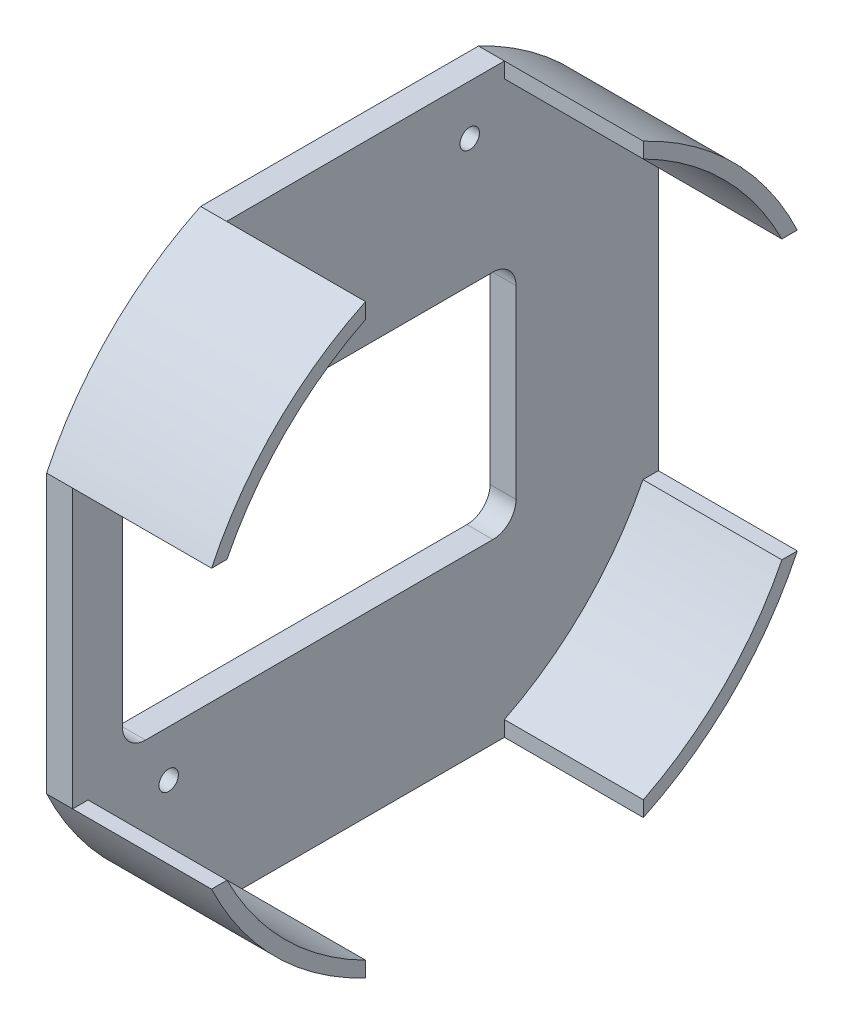
ISO-10303-21;
HEADER;
FILE_DESCRIPTION(('STEP AP214'),'2;1');
FILE_NAME('part.step','',(''),(''),'','','');
FILE_SCHEMA(('AUTOMOTIVE_DESIGN { 1 0 10303 214 1 1 1 1 }'));
ENDSEC;
DATA;
#1=APPLICATION_CONTEXT('core data for automotive mechanical design processes');
#2=APPLICATION_PROTOCOL_DEFINITION('international standard','automotive_design',2000,#1);
#3=PRODUCT_CONTEXT('',#1,'mechanical');
#4=PRODUCT('Part','Part','',(#3));
#5=PRODUCT_RELATED_PRODUCT_CATEGORY('part','',(#4));
#6=PRODUCT_DEFINITION_FORMATION('','',#4);
#7=PRODUCT_DEFINITION_CONTEXT('part definition',#1,'design');
#8=PRODUCT_DEFINITION('design','',#6,#7);
#9=PRODUCT_DEFINITION_SHAPE('','',#8);
#10=(LENGTH_UNIT() NAMED_UNIT(*) SI_UNIT(.MILLI.,.METRE.));
#11=(NAMED_UNIT(*) PLANE_ANGLE_UNIT() SI_UNIT($,.RADIAN.));
#12=(NAMED_UNIT(*) SI_UNIT($,.STERADIAN.) SOLID_ANGLE_UNIT());
#13=UNCERTAINTY_MEASURE_WITH_UNIT(LENGTH_MEASURE(1.E-05),#10,'distance_accuracy_value','');
#14=(GEOMETRIC_REPRESENTATION_CONTEXT(3) GLOBAL_UNCERTAINTY_ASSIGNED_CONTEXT((#13)) GLOBAL_UNIT_ASSIGNED_CONTEXT((#10,
#11,#12)) REPRESENTATION_CONTEXT('',''));
#15=CARTESIAN_POINT('',(0.,0.,0.));
#16=DIRECTION('',(0.,0.,1.));
#17=DIRECTION('',(1.,0.,0.));
#18=AXIS2_PLACEMENT_3D('',#15,#16,#17);
#19=CARTESIAN_POINT('',(5.6,0.,-10.));
#20=DIRECTION('',(-1.,0.,0.));
#21=DIRECTION('',(0.,0.,1.));
#22=AXIS2_PLACEMENT_3D('',#19,#20,#21);
#23=CYLINDRICAL_SURFACE('',#22,70.);
#24=DIRECTION('',(-1.,0.,0.));
#25=VECTOR('',#24,1.);
#26=CARTESIAN_POINT('',(35.6,63.2455532033676,20.));
#27=LINE('',#26,#25);
#28=CARTESIAN_POINT('',(35.6,63.2455532033676,20.));
#29=VERTEX_POINT('',#28);
#30=CARTESIAN_POINT('',(5.6,63.2455532033676,20.));
#31=VERTEX_POINT('',#30);
#32=EDGE_CURVE('E240',#29,#31,#27,.T.);
#33=ORIENTED_EDGE('',*,*,#32,.T.);
#34=DIRECTION('',(1.,0.,0.));
#35=VECTOR('',#34,1.);
#36=CARTESIAN_POINT('',(0.,63.2455532033676,20.));
#37=LINE('',#36,#35);
#38=CARTESIAN_POINT('',(0.,63.2455532033676,20.));
#39=VERTEX_POINT('',#38);
#40=EDGE_CURVE('E223',#39,#31,#37,.T.);
#41=ORIENTED_EDGE('',*,*,#40,.F.);
#42=CARTESIAN_POINT('',(0.,0.,-10.));
#43=DIRECTION('',(1.,0.,0.));
#44=DIRECTION('',(0.,0.,-1.));
#45=AXIS2_PLACEMENT_3D('',#42,#43,#44);
#46=CIRCLE('',#45,70.);
#47=CARTESIAN_POINT('',(0.,30.,53.2455532033676));
#48=VERTEX_POINT('',#47);
#49=EDGE_CURVE('E237',#39,#48,#46,.T.);
#50=ORIENTED_EDGE('',*,*,#49,.T.);
#51=DIRECTION('',(1.,0.,0.));
#52=VECTOR('',#51,1.);
#53=CARTESIAN_POINT('',(0.,30.,53.2455532033676));
#54=LINE('',#53,#52);
#55=CARTESIAN_POINT('',(5.6,30.,53.2455532033676));
#56=VERTEX_POINT('',#55);
#57=EDGE_CURVE('E876',#48,#56,#54,.T.);
#58=ORIENTED_EDGE('',*,*,#57,.T.);
#59=DIRECTION('',(-1.,0.,0.));
#60=VECTOR('',#59,1.);
#61=CARTESIAN_POINT('',(35.6,30.,53.2455532033676));
#62=LINE('',#61,#60);
#63=CARTESIAN_POINT('',(35.6,30.,53.2455532033676));
#64=VERTEX_POINT('',#63);
#65=EDGE_CURVE('E437',#64,#56,#62,.T.);
#66=ORIENTED_EDGE('',*,*,#65,.F.);
#67=CARTESIAN_POINT('',(35.6,0.,-10.));
#68=DIRECTION('',(1.,0.,0.));
#69=DIRECTION('',(0.,0.,-1.));
#70=AXIS2_PLACEMENT_3D('',#67,#68,#69);
#71=CIRCLE('',#70,70.);
#72=EDGE_CURVE('E413',#29,#64,#71,.T.);
#73=ORIENTED_EDGE('',*,*,#72,.F.);
#74=EDGE_LOOP('',(#33,#41,#50,#58,#66,#73));
#75=FACE_BOUND('',#74,.T.);
#76=ADVANCED_FACE('F35',(#75),#23,.T.);
#77=DIRECTION('',(-1.,0.,0.));
#78=VECTOR('',#77,1.);
#79=CARTESIAN_POINT('',(35.6,-30.,53.2455532033676));
#80=LINE('',#79,#78);
#81=CARTESIAN_POINT('',(35.6,-30.,53.2455532033676));
#82=VERTEX_POINT('',#81);
#83=CARTESIAN_POINT('',(5.6,-30.,53.2455532033676));
#84=VERTEX_POINT('',#83);
#85=EDGE_CURVE('E393',#82,#84,#80,.T.);
#86=ORIENTED_EDGE('',*,*,#85,.T.);
#87=DIRECTION('',(1.,0.,0.));
#88=VECTOR('',#87,1.);
#89=CARTESIAN_POINT('',(0.,-30.,53.2455532033676));
#90=LINE('',#89,#88);
#91=CARTESIAN_POINT('',(0.,-30.,53.2455532033676));
#92=VERTEX_POINT('',#91);
#93=EDGE_CURVE('E878',#92,#84,#90,.T.);
#94=ORIENTED_EDGE('',*,*,#93,.F.);
#95=CARTESIAN_POINT('',(0.,-63.2455532033676,20.));
#96=VERTEX_POINT('',#95);
#97=EDGE_CURVE('E248',#92,#96,#46,.T.);
#98=ORIENTED_EDGE('',*,*,#97,.T.);
#99=DIRECTION('',(1.,0.,0.));
#100=VECTOR('',#99,1.);
#101=CARTESIAN_POINT('',(0.,-63.2455532033676,20.));
#102=LINE('',#101,#100);
#103=CARTESIAN_POINT('',(5.6,-63.2455532033676,20.));
#104=VERTEX_POINT('',#103);
#105=EDGE_CURVE('E880',#96,#104,#102,.T.);
#106=ORIENTED_EDGE('',*,*,#105,.T.);
#107=DIRECTION('',(-1.,0.,0.));
#108=VECTOR('',#107,1.);
#109=CARTESIAN_POINT('',(35.6,-63.2455532033676,20.));
#110=LINE('',#109,#108);
#111=CARTESIAN_POINT('',(35.6,-63.2455532033676,20.));
#112=VERTEX_POINT('',#111);
#113=EDGE_CURVE('E409',#112,#104,#110,.T.);
#114=ORIENTED_EDGE('',*,*,#113,.F.);
#115=CARTESIAN_POINT('',(35.6,0.,-10.));
#116=DIRECTION('',(1.,0.,0.));
#117=DIRECTION('',(0.,0.,-1.));
#118=AXIS2_PLACEMENT_3D('',#115,#116,#117);
#119=CIRCLE('',#118,70.);
#120=EDGE_CURVE('E383',#82,#112,#119,.T.);
#121=ORIENTED_EDGE('',*,*,#120,.F.);
#122=EDGE_LOOP('',(#86,#94,#98,#106,#114,#121));
#123=FACE_BOUND('',#122,.T.);
#124=ADVANCED_FACE('F502',(#123),#23,.T.);
#125=DIRECTION('',(-1.,0.,0.));
#126=VECTOR('',#125,1.);
#127=CARTESIAN_POINT('',(35.6,-63.2455532033676,-40.));
#128=LINE('',#127,#126);
#129=CARTESIAN_POINT('',(35.6,-63.2455532033676,-40.));
#130=VERTEX_POINT('',#129);
#131=CARTESIAN_POINT('',(5.6,-63.2455532033676,-40.));
#132=VERTEX_POINT('',#131);
#133=EDGE_CURVE('E363',#130,#132,#128,.T.);
#134=ORIENTED_EDGE('',*,*,#133,.T.);
#135=DIRECTION('',(1.,0.,0.));
#136=VECTOR('',#135,1.);
#137=CARTESIAN_POINT('',(0.,-63.2455532033676,-40.));
#138=LINE('',#137,#136);
#139=CARTESIAN_POINT('',(0.,-63.2455532033676,-40.));
#140=VERTEX_POINT('',#139);
#141=EDGE_CURVE('E336',#140,#132,#138,.T.);
#142=ORIENTED_EDGE('',*,*,#141,.F.);
#143=CARTESIAN_POINT('',(0.,-30.,-73.2455532033676));
#144=VERTEX_POINT('',#143);
#145=EDGE_CURVE('E251',#140,#144,#46,.T.);
#146=ORIENTED_EDGE('',*,*,#145,.T.);
#147=DIRECTION('',(1.,0.,0.));
#148=VECTOR('',#147,1.);
#149=CARTESIAN_POINT('',(0.,-30.,-73.2455532033676));
#150=LINE('',#149,#148);
#151=CARTESIAN_POINT('',(5.6,-30.,-73.2455532033676));
#152=VERTEX_POINT('',#151);
#153=EDGE_CURVE('E334',#144,#152,#150,.T.);
#154=ORIENTED_EDGE('',*,*,#153,.T.);
#155=DIRECTION('',(-1.,0.,0.));
#156=VECTOR('',#155,1.);
#157=CARTESIAN_POINT('',(35.6,-30.,-73.2455532033676));
#158=LINE('',#157,#156);
#159=CARTESIAN_POINT('',(35.6,-30.,-73.2455532033676));
#160=VERTEX_POINT('',#159);
#161=EDGE_CURVE('E379',#160,#152,#158,.T.);
#162=ORIENTED_EDGE('',*,*,#161,.F.);
#163=CARTESIAN_POINT('',(35.6,0.,-10.));
#164=DIRECTION('',(1.,0.,0.));
#165=DIRECTION('',(0.,0.,-1.));
#166=AXIS2_PLACEMENT_3D('',#163,#164,#165);
#167=CIRCLE('',#166,70.);
#168=EDGE_CURVE('E353',#130,#160,#167,.T.);
#169=ORIENTED_EDGE('',*,*,#168,.F.);
#170=EDGE_LOOP('',(#134,#142,#146,#154,#162,#169));
#171=FACE_BOUND('',#170,.T.);
#172=ADVANCED_FACE('F332',(#171),#23,.T.);
#173=CARTESIAN_POINT('',(5.6,0.,-10.));
#174=DIRECTION('',(1.,0.,0.));
#175=DIRECTION('',(0.,0.,-1.));
#176=AXIS2_PLACEMENT_3D('',#173,#174,#175);
#177=PLANE('',#176);
#178=DIRECTION('',(0.,0.,-1.));
#179=VECTOR('',#178,1.);
#180=CARTESIAN_POINT('',(5.6,63.2455532033676,0.));
#181=LINE('',#180,#179);
#182=CARTESIAN_POINT('',(5.6,63.2455532033676,-40.));
#183=VERTEX_POINT('',#182);
#184=EDGE_CURVE('E231',#31,#183,#181,.T.);
#185=ORIENTED_EDGE('',*,*,#184,.F.);
#186=DIRECTION('',(0.,1.,0.));
#187=VECTOR('',#186,1.);
#188=CARTESIAN_POINT('',(5.6,63.2455532033676,20.));
#189=LINE('',#188,#187);
#190=CARTESIAN_POINT('',(5.6,59.9082632030007,20.));
#191=VERTEX_POINT('',#190);
#192=EDGE_CURVE('E417',#191,#31,#189,.T.);
#193=ORIENTED_EDGE('',*,*,#192,.F.);
#194=CARTESIAN_POINT('',(5.6,0.,-10.));
#195=DIRECTION('',(-1.,0.,0.));
#196=DIRECTION('',(0.,0.,-1.));
#197=AXIS2_PLACEMENT_3D('',#194,#195,#196);
#198=CIRCLE('',#197,67.);
#199=CARTESIAN_POINT('',(5.6,30.,49.9082632030007));
#200=VERTEX_POINT('',#199);
#201=EDGE_CURVE('E425',#200,#191,#198,.T.);
#202=ORIENTED_EDGE('',*,*,#201,.F.);
#203=DIRECTION('',(0.,0.,-1.));
#204=VECTOR('',#203,1.);
#205=CARTESIAN_POINT('',(5.6,30.,53.2455532033676));
#206=LINE('',#205,#204);
#207=EDGE_CURVE('E412',#56,#200,#206,.T.);
#208=ORIENTED_EDGE('',*,*,#207,.F.);
#209=DIRECTION('',(0.,1.,0.));
#210=VECTOR('',#209,1.);
#211=CARTESIAN_POINT('',(5.6,0.,53.2455532033676));
#212=LINE('',#211,#210);
#213=EDGE_CURVE('E875',#84,#56,#212,.T.);
#214=ORIENTED_EDGE('',*,*,#213,.F.);
#215=DIRECTION('',(0.,0.,1.));
#216=VECTOR('',#215,1.);
#217=CARTESIAN_POINT('',(5.6,-30.,53.2455532033676));
#218=LINE('',#217,#216);
#219=CARTESIAN_POINT('',(5.6,-30.,49.9082632030007));
#220=VERTEX_POINT('',#219);
#221=EDGE_CURVE('E387',#220,#84,#218,.T.);
#222=ORIENTED_EDGE('',*,*,#221,.F.);
#223=CARTESIAN_POINT('',(5.6,0.,-10.));
#224=DIRECTION('',(-1.,0.,0.));
#225=DIRECTION('',(0.,0.,-1.));
#226=AXIS2_PLACEMENT_3D('',#223,#224,#225);
#227=CIRCLE('',#226,67.);
#228=CARTESIAN_POINT('',(5.6,-59.9082632030007,20.));
#229=VERTEX_POINT('',#228);
#230=EDGE_CURVE('E396',#229,#220,#227,.T.);
#231=ORIENTED_EDGE('',*,*,#230,.F.);
#232=DIRECTION('',(0.,1.,0.));
#233=VECTOR('',#232,1.);
#234=CARTESIAN_POINT('',(5.6,-59.9082632030007,20.));
#235=LINE('',#234,#233);
#236=EDGE_CURVE('E382',#104,#229,#235,.T.);
#237=ORIENTED_EDGE('',*,*,#236,.F.);
#238=DIRECTION('',(0.,0.,1.));
#239=VECTOR('',#238,1.);
#240=CARTESIAN_POINT('',(5.6,-63.2455532033676,0.));
#241=LINE('',#240,#239);
#242=EDGE_CURVE('E351',#132,#104,#241,.T.);
#243=ORIENTED_EDGE('',*,*,#242,.F.);
#244=DIRECTION('',(0.,-1.,0.));
#245=VECTOR('',#244,1.);
#246=CARTESIAN_POINT('',(5.6,-59.9082632030007,-40.));
#247=LINE('',#246,#245);
#248=CARTESIAN_POINT('',(5.6,-59.9082632030007,-40.));
#249=VERTEX_POINT('',#248);
#250=EDGE_CURVE('E357',#249,#132,#247,.T.);
#251=ORIENTED_EDGE('',*,*,#250,.F.);
#252=CARTESIAN_POINT('',(5.6,0.,-10.));
#253=DIRECTION('',(-1.,0.,0.));
#254=DIRECTION('',(0.,0.,-1.));
#255=AXIS2_PLACEMENT_3D('',#252,#253,#254);
#256=CIRCLE('',#255,67.);
#257=CARTESIAN_POINT('',(5.6,-30.,-69.9082632030007));
#258=VERTEX_POINT('',#257);
#259=EDGE_CURVE('E367',#258,#249,#256,.T.);
#260=ORIENTED_EDGE('',*,*,#259,.F.);
#261=DIRECTION('',(0.,0.,1.));
#262=VECTOR('',#261,1.);
#263=CARTESIAN_POINT('',(5.6,-30.,-69.9082632030007));
#264=LINE('',#263,#262);
#265=EDGE_CURVE('E364',#152,#258,#264,.T.);
#266=ORIENTED_EDGE('',*,*,#265,.F.);
#267=DIRECTION('',(0.,-1.,0.));
#268=VECTOR('',#267,1.);
#269=CARTESIAN_POINT('',(5.6,0.,-73.2455532033676));
#270=LINE('',#269,#268);
#271=CARTESIAN_POINT('',(5.6,30.,-73.2455532033676));
#272=VERTEX_POINT('',#271);
#273=EDGE_CURVE('E344',#272,#152,#270,.T.);
#274=ORIENTED_EDGE('',*,*,#273,.F.);
#275=DIRECTION('',(0.,0.,-1.));
#276=VECTOR('',#275,1.);
#277=CARTESIAN_POINT('',(5.6,30.,-69.9082632030007));
#278=LINE('',#277,#276);
#279=CARTESIAN_POINT('',(5.6,30.,-69.9082632030007));
#280=VERTEX_POINT('',#279);
#281=EDGE_CURVE('E454',#280,#272,#278,.T.);
#282=ORIENTED_EDGE('',*,*,#281,.F.);
#283=CARTESIAN_POINT('',(5.6,0.,-10.));
#284=DIRECTION('',(-1.,0.,0.));
#285=DIRECTION('',(0.,0.,-1.));
#286=AXIS2_PLACEMENT_3D('',#283,#284,#285);
#287=CIRCLE('',#286,67.);
#288=CARTESIAN_POINT('',(5.6,59.9082632030007,-40.));
#289=VERTEX_POINT('',#288);
#290=EDGE_CURVE('E440',#289,#280,#287,.T.);
#291=ORIENTED_EDGE('',*,*,#290,.F.);
#292=DIRECTION('',(0.,-1.,0.));
#293=VECTOR('',#292,1.);
#294=CARTESIAN_POINT('',(5.6,63.2455532033676,-40.));
#295=LINE('',#294,#293);
#296=EDGE_CURVE('E445',#183,#289,#295,.T.);
#297=ORIENTED_EDGE('',*,*,#296,.F.);
#298=EDGE_LOOP('',(#185,#193,#202,#208,#214,#222,#231,#237,#243,#251,#260,#266,#274,#282,#291,#297));
#299=FACE_BOUND('',#298,.T.);
#300=DIRECTION('',(0.,0.,1.));
#301=VECTOR('',#300,1.);
#302=CARTESIAN_POINT('',(5.6,25.,42.5));
#303=LINE('',#302,#301);
#304=CARTESIAN_POINT('',(5.6,25.,-37.5));
#305=VERTEX_POINT('',#304);
#306=CARTESIAN_POINT('',(5.6,25.,37.5));
#307=VERTEX_POINT('',#306);
#308=EDGE_CURVE('E314',#305,#307,#303,.T.);
#309=ORIENTED_EDGE('',*,*,#308,.F.);
#310=CARTESIAN_POINT('',(5.6,20.,-37.5));
#311=DIRECTION('',(1.,0.,0.));
#312=DIRECTION('',(0.,0.,-1.));
#313=AXIS2_PLACEMENT_3D('',#310,#311,#312);
#314=CIRCLE('',#313,5.);
#315=CARTESIAN_POINT('',(5.6,20.,-42.5));
#316=VERTEX_POINT('',#315);
#317=EDGE_CURVE('E50',#305,#316,#314,.F.);
#318=ORIENTED_EDGE('',*,*,#317,.T.);
#319=DIRECTION('',(0.,1.,0.));
#320=VECTOR('',#319,1.);
#321=CARTESIAN_POINT('',(5.6,25.,-42.5));
#322=LINE('',#321,#320);
#323=CARTESIAN_POINT('',(5.6,-20.,-42.5));
#324=VERTEX_POINT('',#323);
#325=EDGE_CURVE('E305',#324,#316,#322,.T.);
#326=ORIENTED_EDGE('',*,*,#325,.F.);
#327=CARTESIAN_POINT('',(5.6,-20.,-37.5));
#328=DIRECTION('',(1.,0.,0.));
#329=DIRECTION('',(0.,0.,-1.));
#330=AXIS2_PLACEMENT_3D('',#327,#328,#329);
#331=CIRCLE('',#330,5.);
#332=CARTESIAN_POINT('',(5.6,-25.,-37.5));
#333=VERTEX_POINT('',#332);
#334=EDGE_CURVE('E11',#324,#333,#331,.F.);
#335=ORIENTED_EDGE('',*,*,#334,.T.);
#336=DIRECTION('',(0.,0.,-1.));
#337=VECTOR('',#336,1.);
#338=CARTESIAN_POINT('',(5.6,-25.,42.5));
#339=LINE('',#338,#337);
#340=CARTESIAN_POINT('',(5.6,-25.,37.5));
#341=VERTEX_POINT('',#340);
#342=EDGE_CURVE('E303',#341,#333,#339,.T.);
#343=ORIENTED_EDGE('',*,*,#342,.F.);
#344=CARTESIAN_POINT('',(5.6,-20.,37.5));
#345=DIRECTION('',(1.,0.,0.));
#346=DIRECTION('',(0.,0.,-1.));
#347=AXIS2_PLACEMENT_3D('',#344,#345,#346);
#348=CIRCLE('',#347,5.);
#349=CARTESIAN_POINT('',(5.6,-20.,42.5));
#350=VERTEX_POINT('',#349);
#351=EDGE_CURVE('E281',#341,#350,#348,.F.);
#352=ORIENTED_EDGE('',*,*,#351,.T.);
#353=DIRECTION('',(0.,-1.,0.));
#354=VECTOR('',#353,1.);
#355=CARTESIAN_POINT('',(5.6,25.,42.5));
#356=LINE('',#355,#354);
#357=CARTESIAN_POINT('',(5.6,20.,42.5));
#358=VERTEX_POINT('',#357);
#359=EDGE_CURVE('E309',#358,#350,#356,.T.);
#360=ORIENTED_EDGE('',*,*,#359,.F.);
#361=CARTESIAN_POINT('',(5.6,20.,37.5));
#362=DIRECTION('',(1.,0.,0.));
#363=DIRECTION('',(0.,0.,-1.));
#364=AXIS2_PLACEMENT_3D('',#361,#362,#363);
#365=CIRCLE('',#364,5.);
#366=EDGE_CURVE('E277',#358,#307,#365,.F.);
#367=ORIENTED_EDGE('',*,*,#366,.T.);
#368=EDGE_LOOP('',(#309,#318,#326,#335,#343,#352,#360,#367));
#369=FACE_BOUND('',#368,.T.);
#370=CARTESIAN_POINT('',(5.6,52.5,-32.5));
#371=DIRECTION('',(1.,0.,0.));
#372=DIRECTION('',(0.,0.,1.));
#373=AXIS2_PLACEMENT_3D('',#370,#371,#372);
#374=CIRCLE('',#373,2.1);
#375=CARTESIAN_POINT('',(5.6,52.5,-30.4));
#376=VERTEX_POINT('',#375);
#377=EDGE_CURVE('E312',#376,#376,#374,.T.);
#378=ORIENTED_EDGE('',*,*,#377,.F.);
#379=EDGE_LOOP('',(#378));
#380=FACE_BOUND('',#379,.T.);
#381=CARTESIAN_POINT('',(5.6,-35.,32.5));
#382=DIRECTION('',(1.,0.,0.));
#383=DIRECTION('',(0.,0.,-1.));
#384=AXIS2_PLACEMENT_3D('',#381,#382,#383);
#385=CIRCLE('',#384,2.1);
#386=CARTESIAN_POINT('',(5.6,-35.,30.4));
#387=VERTEX_POINT('',#386);
#388=EDGE_CURVE('E296',#387,#387,#385,.T.);
#389=ORIENTED_EDGE('',*,*,#388,.F.);
#390=EDGE_LOOP('',(#389));
#391=FACE_BOUND('',#390,.T.);
#392=ADVANCED_FACE('F301',(#299,#369,#380,#391),#177,.T.);
#393=CARTESIAN_POINT('',(0.,0.,-10.));
#394=DIRECTION('',(1.,0.,0.));
#395=DIRECTION('',(0.,0.,-1.));
#396=AXIS2_PLACEMENT_3D('',#393,#394,#395);
#397=PLANE('',#396);
#398=CARTESIAN_POINT('',(0.,52.5,-32.5));
#399=DIRECTION('',(1.,0.,0.));
#400=DIRECTION('',(0.,0.,1.));
#401=AXIS2_PLACEMENT_3D('',#398,#399,#400);
#402=CIRCLE('',#401,2.1);
#403=CARTESIAN_POINT('',(0.,52.5,-30.4));
#404=VERTEX_POINT('',#403);
#405=EDGE_CURVE('E255',#404,#404,#402,.T.);
#406=ORIENTED_EDGE('',*,*,#405,.T.);
#407=EDGE_LOOP('',(#406));
#408=FACE_BOUND('',#407,.T.);
#409=ORIENTED_EDGE('',*,*,#49,.F.);
#410=DIRECTION('',(0.,0.,-1.));
#411=VECTOR('',#410,1.);
#412=CARTESIAN_POINT('',(0.,63.2455532033676,0.));
#413=LINE('',#412,#411);
#414=CARTESIAN_POINT('',(0.,63.2455532033676,-40.));
#415=VERTEX_POINT('',#414);
#416=EDGE_CURVE('E220',#39,#415,#413,.T.);
#417=ORIENTED_EDGE('',*,*,#416,.T.);
#418=CARTESIAN_POINT('',(0.,30.,-73.2455532033676));
#419=VERTEX_POINT('',#418);
#420=EDGE_CURVE('E247',#419,#415,#46,.T.);
#421=ORIENTED_EDGE('',*,*,#420,.F.);
#422=DIRECTION('',(0.,-1.,0.));
#423=VECTOR('',#422,1.);
#424=CARTESIAN_POINT('',(0.,0.,-73.2455532033676));
#425=LINE('',#424,#423);
#426=EDGE_CURVE('E340',#419,#144,#425,.T.);
#427=ORIENTED_EDGE('',*,*,#426,.T.);
#428=ORIENTED_EDGE('',*,*,#145,.F.);
#429=DIRECTION('',(0.,0.,1.));
#430=VECTOR('',#429,1.);
#431=CARTESIAN_POINT('',(0.,-63.2455532033676,0.));
#432=LINE('',#431,#430);
#433=EDGE_CURVE('E339',#140,#96,#432,.T.);
#434=ORIENTED_EDGE('',*,*,#433,.T.);
#435=ORIENTED_EDGE('',*,*,#97,.F.);
#436=DIRECTION('',(0.,1.,0.));
#437=VECTOR('',#436,1.);
#438=CARTESIAN_POINT('',(0.,0.,53.2455532033676));
#439=LINE('',#438,#437);
#440=EDGE_CURVE('E246',#92,#48,#439,.T.);
#441=ORIENTED_EDGE('',*,*,#440,.T.);
#442=EDGE_LOOP('',(#409,#417,#421,#427,#428,#434,#435,#441));
#443=FACE_BOUND('',#442,.T.);
#444=DIRECTION('',(0.,0.,-1.));
#445=VECTOR('',#444,1.);
#446=CARTESIAN_POINT('',(0.,-25.,42.5));
#447=LINE('',#446,#445);
#448=CARTESIAN_POINT('',(0.,-25.,37.5));
#449=VERTEX_POINT('',#448);
#450=CARTESIAN_POINT('',(0.,-25.,-37.5));
#451=VERTEX_POINT('',#450);
#452=EDGE_CURVE('E290',#449,#451,#447,.T.);
#453=ORIENTED_EDGE('',*,*,#452,.T.);
#454=CARTESIAN_POINT('',(0.,-20.,-37.5));
#455=DIRECTION('',(1.,0.,0.));
#456=DIRECTION('',(0.,0.,-1.));
#457=AXIS2_PLACEMENT_3D('',#454,#455,#456);
#458=CIRCLE('',#457,5.);
#459=CARTESIAN_POINT('',(0.,-20.,-42.5));
#460=VERTEX_POINT('',#459);
#461=EDGE_CURVE('E43',#451,#460,#458,.T.);
#462=ORIENTED_EDGE('',*,*,#461,.T.);
#463=DIRECTION('',(0.,1.,0.));
#464=VECTOR('',#463,1.);
#465=CARTESIAN_POINT('',(0.,25.,-42.5));
#466=LINE('',#465,#464);
#467=CARTESIAN_POINT('',(0.,20.,-42.5));
#468=VERTEX_POINT('',#467);
#469=EDGE_CURVE('E288',#460,#468,#466,.T.);
#470=ORIENTED_EDGE('',*,*,#469,.T.);
#471=CARTESIAN_POINT('',(0.,20.,-37.5));
#472=DIRECTION('',(1.,0.,0.));
#473=DIRECTION('',(0.,0.,-1.));
#474=AXIS2_PLACEMENT_3D('',#471,#472,#473);
#475=CIRCLE('',#474,5.);
#476=CARTESIAN_POINT('',(0.,25.,-37.5));
#477=VERTEX_POINT('',#476);
#478=EDGE_CURVE('E283',#468,#477,#475,.T.);
#479=ORIENTED_EDGE('',*,*,#478,.T.);
#480=DIRECTION('',(0.,0.,1.));
#481=VECTOR('',#480,1.);
#482=CARTESIAN_POINT('',(0.,25.,42.5));
#483=LINE('',#482,#481);
#484=CARTESIAN_POINT('',(0.,25.,37.5));
#485=VERTEX_POINT('',#484);
#486=EDGE_CURVE('E295',#477,#485,#483,.T.);
#487=ORIENTED_EDGE('',*,*,#486,.T.);
#488=CARTESIAN_POINT('',(0.,20.,37.5));
#489=DIRECTION('',(1.,0.,0.));
#490=DIRECTION('',(0.,0.,-1.));
#491=AXIS2_PLACEMENT_3D('',#488,#489,#490);
#492=CIRCLE('',#491,5.);
#493=CARTESIAN_POINT('',(0.,20.,42.5));
#494=VERTEX_POINT('',#493);
#495=EDGE_CURVE('E275',#485,#494,#492,.T.);
#496=ORIENTED_EDGE('',*,*,#495,.T.);
#497=DIRECTION('',(0.,-1.,0.));
#498=VECTOR('',#497,1.);
#499=CARTESIAN_POINT('',(0.,25.,42.5));
#500=LINE('',#499,#498);
#501=CARTESIAN_POINT('',(0.,-20.,42.5));
#502=VERTEX_POINT('',#501);
#503=EDGE_CURVE('E320',#494,#502,#500,.T.);
#504=ORIENTED_EDGE('',*,*,#503,.T.);
#505=CARTESIAN_POINT('',(0.,-20.,37.5));
#506=DIRECTION('',(1.,0.,0.));
#507=DIRECTION('',(0.,0.,-1.));
#508=AXIS2_PLACEMENT_3D('',#505,#506,#507);
#509=CIRCLE('',#508,5.);
#510=EDGE_CURVE('E279',#502,#449,#509,.T.);
#511=ORIENTED_EDGE('',*,*,#510,.T.);
#512=EDGE_LOOP('',(#453,#462,#470,#479,#487,#496,#504,#511));
#513=FACE_BOUND('',#512,.T.);
#514=CARTESIAN_POINT('',(0.,-35.,32.5));
#515=DIRECTION('',(1.,0.,0.));
#516=DIRECTION('',(0.,0.,-1.));
#517=AXIS2_PLACEMENT_3D('',#514,#515,#516);
#518=CIRCLE('',#517,2.1);
#519=CARTESIAN_POINT('',(0.,-35.,30.4));
#520=VERTEX_POINT('',#519);
#521=EDGE_CURVE('E470',#520,#520,#518,.T.);
#522=ORIENTED_EDGE('',*,*,#521,.T.);
#523=EDGE_LOOP('',(#522));
#524=FACE_BOUND('',#523,.T.);
#525=ADVANCED_FACE('F243',(#408,#443,#513,#524),#397,.F.);
#526=ORIENTED_EDGE('',*,*,#420,.T.);
#527=DIRECTION('',(1.,0.,0.));
#528=VECTOR('',#527,1.);
#529=CARTESIAN_POINT('',(0.,63.2455532033676,-40.));
#530=LINE('',#529,#528);
#531=EDGE_CURVE('E226',#415,#183,#530,.T.);
#532=ORIENTED_EDGE('',*,*,#531,.T.);
#533=DIRECTION('',(-1.,0.,0.));
#534=VECTOR('',#533,1.);
#535=CARTESIAN_POINT('',(35.6,63.2455532033676,-40.));
#536=LINE('',#535,#534);
#537=CARTESIAN_POINT('',(35.6,63.2455532033676,-40.));
#538=VERTEX_POINT('',#537);
#539=EDGE_CURVE('E461',#538,#183,#536,.T.);
#540=ORIENTED_EDGE('',*,*,#539,.F.);
#541=CARTESIAN_POINT('',(35.6,0.,-10.));
#542=DIRECTION('',(1.,0.,0.));
#543=DIRECTION('',(0.,0.,-1.));
#544=AXIS2_PLACEMENT_3D('',#541,#542,#543);
#545=CIRCLE('',#544,70.);
#546=CARTESIAN_POINT('',(35.6,30.,-73.2455532033676));
#547=VERTEX_POINT('',#546);
#548=EDGE_CURVE('E447',#547,#538,#545,.T.);
#549=ORIENTED_EDGE('',*,*,#548,.F.);
#550=DIRECTION('',(-1.,0.,0.));
#551=VECTOR('',#550,1.);
#552=CARTESIAN_POINT('',(35.6,30.,-73.2455532033676));
#553=LINE('',#552,#551);
#554=EDGE_CURVE('E464',#547,#272,#553,.T.);
#555=ORIENTED_EDGE('',*,*,#554,.T.);
#556=DIRECTION('',(1.,0.,0.));
#557=VECTOR('',#556,1.);
#558=CARTESIAN_POINT('',(0.,30.,-73.2455532033676));
#559=LINE('',#558,#557);
#560=EDGE_CURVE('E343',#419,#272,#559,.T.);
#561=ORIENTED_EDGE('',*,*,#560,.F.);
#562=EDGE_LOOP('',(#526,#532,#540,#549,#555,#561));
#563=FACE_BOUND('',#562,.T.);
#564=ADVANCED_FACE('F504',(#563),#23,.T.);
#565=CARTESIAN_POINT('',(5.6,52.5,-32.5));
#566=DIRECTION('',(-1.,0.,0.));
#567=DIRECTION('',(0.,0.,1.));
#568=AXIS2_PLACEMENT_3D('',#565,#566,#567);
#569=CYLINDRICAL_SURFACE('',#568,2.1);
#570=ORIENTED_EDGE('',*,*,#377,.T.);
#571=EDGE_LOOP('',(#570));
#572=FACE_BOUND('',#571,.T.);
#573=ORIENTED_EDGE('',*,*,#405,.F.);
#574=EDGE_LOOP('',(#573));
#575=FACE_BOUND('',#574,.T.);
#576=ADVANCED_FACE('F511',(#572,#575),#569,.F.);
#577=CARTESIAN_POINT('',(5.6,25.,-42.5));
#578=DIRECTION('',(0.,0.,1.));
#579=DIRECTION('',(0.,-1.,0.));
#580=AXIS2_PLACEMENT_3D('',#577,#578,#579);
#581=PLANE('',#580);
#582=ORIENTED_EDGE('',*,*,#325,.T.);
#583=DIRECTION('',(-1.,0.,0.));
#584=VECTOR('',#583,1.);
#585=CARTESIAN_POINT('',(0.,20.,-42.5));
#586=LINE('',#585,#584);
#587=EDGE_CURVE('E272',#316,#468,#586,.T.);
#588=ORIENTED_EDGE('',*,*,#587,.T.);
#589=ORIENTED_EDGE('',*,*,#469,.F.);
#590=DIRECTION('',(-1.,0.,0.));
#591=VECTOR('',#590,1.);
#592=CARTESIAN_POINT('',(5.6,-20.,-42.5));
#593=LINE('',#592,#591);
#594=EDGE_CURVE('E57',#460,#324,#593,.F.);
#595=ORIENTED_EDGE('',*,*,#594,.T.);
#596=EDGE_LOOP('',(#582,#588,#589,#595));
#597=FACE_BOUND('',#596,.T.);
#598=ADVANCED_FACE('F293',(#597),#581,.T.);
#599=CARTESIAN_POINT('',(5.6,25.,42.5));
#600=DIRECTION('',(0.,-1.,0.));
#601=DIRECTION('',(0.,0.,-1.));
#602=AXIS2_PLACEMENT_3D('',#599,#600,#601);
#603=PLANE('',#602);
#604=ORIENTED_EDGE('',*,*,#308,.T.);
#605=DIRECTION('',(-1.,0.,0.));
#606=VECTOR('',#605,1.);
#607=CARTESIAN_POINT('',(0.,25.,37.5));
#608=LINE('',#607,#606);
#609=EDGE_CURVE('E258',#307,#485,#608,.T.);
#610=ORIENTED_EDGE('',*,*,#609,.T.);
#611=ORIENTED_EDGE('',*,*,#486,.F.);
#612=DIRECTION('',(-1.,0.,0.));
#613=VECTOR('',#612,1.);
#614=CARTESIAN_POINT('',(5.6,25.,-37.5));
#615=LINE('',#614,#613);
#616=EDGE_CURVE('E250',#477,#305,#615,.F.);
#617=ORIENTED_EDGE('',*,*,#616,.T.);
#618=EDGE_LOOP('',(#604,#610,#611,#617));
#619=FACE_BOUND('',#618,.T.);
#620=ADVANCED_FACE('F478',(#619),#603,.T.);
#621=CARTESIAN_POINT('',(5.6,25.,42.5));
#622=DIRECTION('',(0.,0.,-1.));
#623=DIRECTION('',(0.,1.,0.));
#624=AXIS2_PLACEMENT_3D('',#621,#622,#623);
#625=PLANE('',#624);
#626=ORIENTED_EDGE('',*,*,#503,.F.);
#627=DIRECTION('',(-1.,0.,0.));
#628=VECTOR('',#627,1.);
#629=CARTESIAN_POINT('',(5.6,20.,42.5));
#630=LINE('',#629,#628);
#631=EDGE_CURVE('E264',#494,#358,#630,.F.);
#632=ORIENTED_EDGE('',*,*,#631,.T.);
#633=ORIENTED_EDGE('',*,*,#359,.T.);
#634=DIRECTION('',(-1.,0.,0.));
#635=VECTOR('',#634,1.);
#636=CARTESIAN_POINT('',(0.,-20.,42.5));
#637=LINE('',#636,#635);
#638=EDGE_CURVE('E261',#350,#502,#637,.T.);
#639=ORIENTED_EDGE('',*,*,#638,.T.);
#640=EDGE_LOOP('',(#626,#632,#633,#639));
#641=FACE_BOUND('',#640,.T.);
#642=ADVANCED_FACE('F487',(#641),#625,.T.);
#643=CARTESIAN_POINT('',(5.6,-25.,42.5));
#644=DIRECTION('',(0.,1.,0.));
#645=DIRECTION('',(0.,0.,1.));
#646=AXIS2_PLACEMENT_3D('',#643,#644,#645);
#647=PLANE('',#646);
#648=ORIENTED_EDGE('',*,*,#452,.F.);
#649=DIRECTION('',(-1.,0.,0.));
#650=VECTOR('',#649,1.);
#651=CARTESIAN_POINT('',(5.6,-25.,37.5));
#652=LINE('',#651,#650);
#653=EDGE_CURVE('E269',#449,#341,#652,.F.);
#654=ORIENTED_EDGE('',*,*,#653,.T.);
#655=ORIENTED_EDGE('',*,*,#342,.T.);
#656=DIRECTION('',(-1.,0.,0.));
#657=VECTOR('',#656,1.);
#658=CARTESIAN_POINT('',(0.,-25.,-37.5));
#659=LINE('',#658,#657);
#660=EDGE_CURVE('E266',#333,#451,#659,.T.);
#661=ORIENTED_EDGE('',*,*,#660,.T.);
#662=EDGE_LOOP('',(#648,#654,#655,#661));
#663=FACE_BOUND('',#662,.T.);
#664=ADVANCED_FACE('F307',(#663),#647,.T.);
#665=CARTESIAN_POINT('',(5.6,-35.,32.5));
#666=DIRECTION('',(-1.,0.,0.));
#667=DIRECTION('',(0.,0.,1.));
#668=AXIS2_PLACEMENT_3D('',#665,#666,#667);
#669=CYLINDRICAL_SURFACE('',#668,2.1);
#670=ORIENTED_EDGE('',*,*,#388,.T.);
#671=EDGE_LOOP('',(#670));
#672=FACE_BOUND('',#671,.T.);
#673=ORIENTED_EDGE('',*,*,#521,.F.);
#674=EDGE_LOOP('',(#673));
#675=FACE_BOUND('',#674,.T.);
#676=ADVANCED_FACE('F536',(#672,#675),#669,.F.);
#677=CARTESIAN_POINT('',(35.6,0.,-10.));
#678=DIRECTION('',(-1.,0.,0.));
#679=DIRECTION('',(0.,0.,1.));
#680=AXIS2_PLACEMENT_3D('',#677,#678,#679);
#681=CYLINDRICAL_SURFACE('',#680,67.);
#682=ORIENTED_EDGE('',*,*,#290,.T.);
#683=DIRECTION('',(-1.,0.,0.));
#684=VECTOR('',#683,1.);
#685=CARTESIAN_POINT('',(35.6,30.,-69.9082632030007));
#686=LINE('',#685,#684);
#687=CARTESIAN_POINT('',(35.6,30.,-69.9082632030007));
#688=VERTEX_POINT('',#687);
#689=EDGE_CURVE('E467',#688,#280,#686,.T.);
#690=ORIENTED_EDGE('',*,*,#689,.F.);
#691=CARTESIAN_POINT('',(35.6,0.,-10.));
#692=DIRECTION('',(-1.,0.,0.));
#693=DIRECTION('',(0.,0.,-1.));
#694=AXIS2_PLACEMENT_3D('',#691,#692,#693);
#695=CIRCLE('',#694,67.);
#696=CARTESIAN_POINT('',(35.6,59.9082632030007,-40.));
#697=VERTEX_POINT('',#696);
#698=EDGE_CURVE('E441',#697,#688,#695,.T.);
#699=ORIENTED_EDGE('',*,*,#698,.F.);
#700=DIRECTION('',(-1.,0.,0.));
#701=VECTOR('',#700,1.);
#702=CARTESIAN_POINT('',(35.6,59.9082632030007,-40.));
#703=LINE('',#702,#701);
#704=EDGE_CURVE('E451',#697,#289,#703,.T.);
#705=ORIENTED_EDGE('',*,*,#704,.T.);
#706=EDGE_LOOP('',(#682,#690,#699,#705));
#707=FACE_BOUND('',#706,.T.);
#708=ADVANCED_FACE('F539',(#707),#681,.F.);
#709=CARTESIAN_POINT('',(35.6,30.,-69.9082632030007));
#710=DIRECTION('',(0.,1.,0.));
#711=DIRECTION('',(0.,0.,1.));
#712=AXIS2_PLACEMENT_3D('',#709,#710,#711);
#713=PLANE('',#712);
#714=ORIENTED_EDGE('',*,*,#281,.T.);
#715=ORIENTED_EDGE('',*,*,#554,.F.);
#716=DIRECTION('',(0.,0.,-1.));
#717=VECTOR('',#716,1.);
#718=CARTESIAN_POINT('',(35.6,30.,-69.9082632030007));
#719=LINE('',#718,#717);
#720=EDGE_CURVE('E444',#688,#547,#719,.T.);
#721=ORIENTED_EDGE('',*,*,#720,.F.);
#722=ORIENTED_EDGE('',*,*,#689,.T.);
#723=EDGE_LOOP('',(#714,#715,#721,#722));
#724=FACE_BOUND('',#723,.T.);
#725=ADVANCED_FACE('F543',(#724),#713,.F.);
#726=CARTESIAN_POINT('',(35.6,63.2455532033676,-40.));
#727=DIRECTION('',(0.,0.,-1.));
#728=DIRECTION('',(-1.,0.,0.));
#729=AXIS2_PLACEMENT_3D('',#726,#727,#728);
#730=PLANE('',#729);
#731=ORIENTED_EDGE('',*,*,#296,.T.);
#732=ORIENTED_EDGE('',*,*,#704,.F.);
#733=DIRECTION('',(0.,-1.,0.));
#734=VECTOR('',#733,1.);
#735=CARTESIAN_POINT('',(35.6,63.2455532033676,-40.));
#736=LINE('',#735,#734);
#737=EDGE_CURVE('E449',#538,#697,#736,.T.);
#738=ORIENTED_EDGE('',*,*,#737,.F.);
#739=ORIENTED_EDGE('',*,*,#539,.T.);
#740=EDGE_LOOP('',(#731,#732,#738,#739));
#741=FACE_BOUND('',#740,.T.);
#742=ADVANCED_FACE('F547',(#741),#730,.F.);
#743=CARTESIAN_POINT('',(35.6,0.,-10.));
#744=DIRECTION('',(1.,0.,0.));
#745=DIRECTION('',(0.,0.,-1.));
#746=AXIS2_PLACEMENT_3D('',#743,#744,#745);
#747=PLANE('',#746);
#748=ORIENTED_EDGE('',*,*,#698,.T.);
#749=ORIENTED_EDGE('',*,*,#720,.T.);
#750=ORIENTED_EDGE('',*,*,#548,.T.);
#751=ORIENTED_EDGE('',*,*,#737,.T.);
#752=EDGE_LOOP('',(#748,#749,#750,#751));
#753=FACE_BOUND('',#752,.T.);
#754=ADVANCED_FACE('F551',(#753),#747,.T.);
#755=CARTESIAN_POINT('',(35.6,30.,53.2455532033676));
#756=DIRECTION('',(0.,1.,0.));
#757=DIRECTION('',(0.,0.,1.));
#758=AXIS2_PLACEMENT_3D('',#755,#756,#757);
#759=PLANE('',#758);
#760=ORIENTED_EDGE('',*,*,#207,.T.);
#761=DIRECTION('',(-1.,0.,0.));
#762=VECTOR('',#761,1.);
#763=CARTESIAN_POINT('',(35.6,30.,49.9082632030007));
#764=LINE('',#763,#762);
#765=CARTESIAN_POINT('',(35.6,30.,49.9082632030007));
#766=VERTEX_POINT('',#765);
#767=EDGE_CURVE('E434',#766,#200,#764,.T.);
#768=ORIENTED_EDGE('',*,*,#767,.F.);
#769=DIRECTION('',(0.,0.,-1.));
#770=VECTOR('',#769,1.);
#771=CARTESIAN_POINT('',(35.6,30.,53.2455532033676));
#772=LINE('',#771,#770);
#773=EDGE_CURVE('E416',#64,#766,#772,.T.);
#774=ORIENTED_EDGE('',*,*,#773,.F.);
#775=ORIENTED_EDGE('',*,*,#65,.T.);
#776=EDGE_LOOP('',(#760,#768,#774,#775));
#777=FACE_BOUND('',#776,.T.);
#778=ADVANCED_FACE('F555',(#777),#759,.F.);
#779=CARTESIAN_POINT('',(35.6,0.,-10.));
#780=DIRECTION('',(-1.,0.,0.));
#781=DIRECTION('',(0.,0.,1.));
#782=AXIS2_PLACEMENT_3D('',#779,#780,#781);
#783=CYLINDRICAL_SURFACE('',#782,67.);
#784=ORIENTED_EDGE('',*,*,#201,.T.);
#785=DIRECTION('',(-1.,0.,0.));
#786=VECTOR('',#785,1.);
#787=CARTESIAN_POINT('',(35.6,59.9082632030007,20.));
#788=LINE('',#787,#786);
#789=CARTESIAN_POINT('',(35.6,59.9082632030007,20.));
#790=VERTEX_POINT('',#789);
#791=EDGE_CURVE('E431',#790,#191,#788,.T.);
#792=ORIENTED_EDGE('',*,*,#791,.F.);
#793=CARTESIAN_POINT('',(35.6,0.,-10.));
#794=DIRECTION('',(-1.,0.,0.));
#795=DIRECTION('',(0.,0.,-1.));
#796=AXIS2_PLACEMENT_3D('',#793,#794,#795);
#797=CIRCLE('',#796,67.);
#798=EDGE_CURVE('E419',#766,#790,#797,.T.);
#799=ORIENTED_EDGE('',*,*,#798,.F.);
#800=ORIENTED_EDGE('',*,*,#767,.T.);
#801=EDGE_LOOP('',(#784,#792,#799,#800));
#802=FACE_BOUND('',#801,.T.);
#803=ADVANCED_FACE('F559',(#802),#783,.F.);
#804=CARTESIAN_POINT('',(35.6,63.2455532033676,20.));
#805=DIRECTION('',(0.,0.,1.));
#806=DIRECTION('',(1.,0.,0.));
#807=AXIS2_PLACEMENT_3D('',#804,#805,#806);
#808=PLANE('',#807);
#809=ORIENTED_EDGE('',*,*,#192,.T.);
#810=ORIENTED_EDGE('',*,*,#32,.F.);
#811=DIRECTION('',(0.,1.,0.));
#812=VECTOR('',#811,1.);
#813=CARTESIAN_POINT('',(35.6,63.2455532033676,20.));
#814=LINE('',#813,#812);
#815=EDGE_CURVE('E421',#790,#29,#814,.T.);
#816=ORIENTED_EDGE('',*,*,#815,.F.);
#817=ORIENTED_EDGE('',*,*,#791,.T.);
#818=EDGE_LOOP('',(#809,#810,#816,#817));
#819=FACE_BOUND('',#818,.T.);
#820=ADVANCED_FACE('F563',(#819),#808,.F.);
#821=CARTESIAN_POINT('',(35.6,0.,-10.));
#822=DIRECTION('',(1.,0.,0.));
#823=DIRECTION('',(0.,0.,-1.));
#824=AXIS2_PLACEMENT_3D('',#821,#822,#823);
#825=PLANE('',#824);
#826=ORIENTED_EDGE('',*,*,#72,.T.);
#827=ORIENTED_EDGE('',*,*,#773,.T.);
#828=ORIENTED_EDGE('',*,*,#798,.T.);
#829=ORIENTED_EDGE('',*,*,#815,.T.);
#830=EDGE_LOOP('',(#826,#827,#828,#829));
#831=FACE_BOUND('',#830,.T.);
#832=ADVANCED_FACE('F567',(#831),#825,.T.);
#833=CARTESIAN_POINT('',(35.6,-59.9082632030007,20.));
#834=DIRECTION('',(0.,0.,1.));
#835=DIRECTION('',(1.,0.,0.));
#836=AXIS2_PLACEMENT_3D('',#833,#834,#835);
#837=PLANE('',#836);
#838=ORIENTED_EDGE('',*,*,#236,.T.);
#839=DIRECTION('',(-1.,0.,0.));
#840=VECTOR('',#839,1.);
#841=CARTESIAN_POINT('',(35.6,-59.9082632030007,20.));
#842=LINE('',#841,#840);
#843=CARTESIAN_POINT('',(35.6,-59.9082632030007,20.));
#844=VERTEX_POINT('',#843);
#845=EDGE_CURVE('E406',#844,#229,#842,.T.);
#846=ORIENTED_EDGE('',*,*,#845,.F.);
#847=DIRECTION('',(0.,1.,0.));
#848=VECTOR('',#847,1.);
#849=CARTESIAN_POINT('',(35.6,-59.9082632030007,20.));
#850=LINE('',#849,#848);
#851=EDGE_CURVE('E386',#112,#844,#850,.T.);
#852=ORIENTED_EDGE('',*,*,#851,.F.);
#853=ORIENTED_EDGE('',*,*,#113,.T.);
#854=EDGE_LOOP('',(#838,#846,#852,#853));
#855=FACE_BOUND('',#854,.T.);
#856=ADVANCED_FACE('F571',(#855),#837,.F.);
#857=CARTESIAN_POINT('',(35.6,0.,-10.));
#858=DIRECTION('',(-1.,0.,0.));
#859=DIRECTION('',(0.,0.,1.));
#860=AXIS2_PLACEMENT_3D('',#857,#858,#859);
#861=CYLINDRICAL_SURFACE('',#860,67.);
#862=ORIENTED_EDGE('',*,*,#230,.T.);
#863=DIRECTION('',(-1.,0.,0.));
#864=VECTOR('',#863,1.);
#865=CARTESIAN_POINT('',(35.6,-30.,49.9082632030007));
#866=LINE('',#865,#864);
#867=CARTESIAN_POINT('',(35.6,-30.,49.9082632030007));
#868=VERTEX_POINT('',#867);
#869=EDGE_CURVE('E403',#868,#220,#866,.T.);
#870=ORIENTED_EDGE('',*,*,#869,.F.);
#871=CARTESIAN_POINT('',(35.6,0.,-10.));
#872=DIRECTION('',(-1.,0.,0.));
#873=DIRECTION('',(0.,0.,-1.));
#874=AXIS2_PLACEMENT_3D('',#871,#872,#873);
#875=CIRCLE('',#874,67.);
#876=EDGE_CURVE('E389',#844,#868,#875,.T.);
#877=ORIENTED_EDGE('',*,*,#876,.F.);
#878=ORIENTED_EDGE('',*,*,#845,.T.);
#879=EDGE_LOOP('',(#862,#870,#877,#878));
#880=FACE_BOUND('',#879,.T.);
#881=ADVANCED_FACE('F575',(#880),#861,.F.);
#882=CARTESIAN_POINT('',(35.6,-30.,53.2455532033676));
#883=DIRECTION('',(0.,-1.,0.));
#884=DIRECTION('',(0.,0.,-1.));
#885=AXIS2_PLACEMENT_3D('',#882,#883,#884);
#886=PLANE('',#885);
#887=ORIENTED_EDGE('',*,*,#221,.T.);
#888=ORIENTED_EDGE('',*,*,#85,.F.);
#889=DIRECTION('',(0.,0.,1.));
#890=VECTOR('',#889,1.);
#891=CARTESIAN_POINT('',(35.6,-30.,53.2455532033676));
#892=LINE('',#891,#890);
#893=EDGE_CURVE('E391',#868,#82,#892,.T.);
#894=ORIENTED_EDGE('',*,*,#893,.F.);
#895=ORIENTED_EDGE('',*,*,#869,.T.);
#896=EDGE_LOOP('',(#887,#888,#894,#895));
#897=FACE_BOUND('',#896,.T.);
#898=ADVANCED_FACE('F579',(#897),#886,.F.);
#899=CARTESIAN_POINT('',(35.6,0.,-10.));
#900=DIRECTION('',(1.,0.,0.));
#901=DIRECTION('',(0.,0.,-1.));
#902=AXIS2_PLACEMENT_3D('',#899,#900,#901);
#903=PLANE('',#902);
#904=ORIENTED_EDGE('',*,*,#120,.T.);
#905=ORIENTED_EDGE('',*,*,#851,.T.);
#906=ORIENTED_EDGE('',*,*,#876,.T.);
#907=ORIENTED_EDGE('',*,*,#893,.T.);
#908=EDGE_LOOP('',(#904,#905,#906,#907));
#909=FACE_BOUND('',#908,.T.);
#910=ADVANCED_FACE('F583',(#909),#903,.T.);
#911=CARTESIAN_POINT('',(35.6,-30.,-69.9082632030007));
#912=DIRECTION('',(0.,-1.,0.));
#913=DIRECTION('',(0.,0.,-1.));
#914=AXIS2_PLACEMENT_3D('',#911,#912,#913);
#915=PLANE('',#914);
#916=ORIENTED_EDGE('',*,*,#265,.T.);
#917=DIRECTION('',(-1.,0.,0.));
#918=VECTOR('',#917,1.);
#919=CARTESIAN_POINT('',(35.6,-30.,-69.9082632030007));
#920=LINE('',#919,#918);
#921=CARTESIAN_POINT('',(35.6,-30.,-69.9082632030007));
#922=VERTEX_POINT('',#921);
#923=EDGE_CURVE('E376',#922,#258,#920,.T.);
#924=ORIENTED_EDGE('',*,*,#923,.F.);
#925=DIRECTION('',(0.,0.,1.));
#926=VECTOR('',#925,1.);
#927=CARTESIAN_POINT('',(35.6,-30.,-69.9082632030007));
#928=LINE('',#927,#926);
#929=EDGE_CURVE('E356',#160,#922,#928,.T.);
#930=ORIENTED_EDGE('',*,*,#929,.F.);
#931=ORIENTED_EDGE('',*,*,#161,.T.);
#932=EDGE_LOOP('',(#916,#924,#930,#931));
#933=FACE_BOUND('',#932,.T.);
#934=ADVANCED_FACE('F587',(#933),#915,.F.);
#935=CARTESIAN_POINT('',(35.6,0.,-10.));
#936=DIRECTION('',(-1.,0.,0.));
#937=DIRECTION('',(0.,0.,1.));
#938=AXIS2_PLACEMENT_3D('',#935,#936,#937);
#939=CYLINDRICAL_SURFACE('',#938,67.);
#940=ORIENTED_EDGE('',*,*,#259,.T.);
#941=DIRECTION('',(-1.,0.,0.));
#942=VECTOR('',#941,1.);
#943=CARTESIAN_POINT('',(35.6,-59.9082632030007,-40.));
#944=LINE('',#943,#942);
#945=CARTESIAN_POINT('',(35.6,-59.9082632030007,-40.));
#946=VERTEX_POINT('',#945);
#947=EDGE_CURVE('E373',#946,#249,#944,.T.);
#948=ORIENTED_EDGE('',*,*,#947,.F.);
#949=CARTESIAN_POINT('',(35.6,0.,-10.));
#950=DIRECTION('',(-1.,0.,0.));
#951=DIRECTION('',(0.,0.,-1.));
#952=AXIS2_PLACEMENT_3D('',#949,#950,#951);
#953=CIRCLE('',#952,67.);
#954=EDGE_CURVE('E359',#922,#946,#953,.T.);
#955=ORIENTED_EDGE('',*,*,#954,.F.);
#956=ORIENTED_EDGE('',*,*,#923,.T.);
#957=EDGE_LOOP('',(#940,#948,#955,#956));
#958=FACE_BOUND('',#957,.T.);
#959=ADVANCED_FACE('F591',(#958),#939,.F.);
#960=CARTESIAN_POINT('',(35.6,-59.9082632030007,-40.));
#961=DIRECTION('',(0.,0.,-1.));
#962=DIRECTION('',(0.,1.,0.));
#963=AXIS2_PLACEMENT_3D('',#960,#961,#962);
#964=PLANE('',#963);
#965=ORIENTED_EDGE('',*,*,#250,.T.);
#966=ORIENTED_EDGE('',*,*,#133,.F.);
#967=DIRECTION('',(0.,-1.,0.));
#968=VECTOR('',#967,1.);
#969=CARTESIAN_POINT('',(35.6,-59.9082632030007,-40.));
#970=LINE('',#969,#968);
#971=EDGE_CURVE('E361',#946,#130,#970,.T.);
#972=ORIENTED_EDGE('',*,*,#971,.F.);
#973=ORIENTED_EDGE('',*,*,#947,.T.);
#974=EDGE_LOOP('',(#965,#966,#972,#973));
#975=FACE_BOUND('',#974,.T.);
#976=ADVANCED_FACE('F595',(#975),#964,.F.);
#977=CARTESIAN_POINT('',(35.6,0.,-10.));
#978=DIRECTION('',(1.,0.,0.));
#979=DIRECTION('',(0.,0.,-1.));
#980=AXIS2_PLACEMENT_3D('',#977,#978,#979);
#981=PLANE('',#980);
#982=ORIENTED_EDGE('',*,*,#168,.T.);
#983=ORIENTED_EDGE('',*,*,#929,.T.);
#984=ORIENTED_EDGE('',*,*,#954,.T.);
#985=ORIENTED_EDGE('',*,*,#971,.T.);
#986=EDGE_LOOP('',(#982,#983,#984,#985));
#987=FACE_BOUND('',#986,.T.);
#988=ADVANCED_FACE('F599',(#987),#981,.T.);
#989=CARTESIAN_POINT('',(0.,0.,-73.2455532033676));
#990=DIRECTION('',(0.,0.,1.));
#991=DIRECTION('',(1.,0.,0.));
#992=AXIS2_PLACEMENT_3D('',#989,#990,#991);
#993=PLANE('',#992);
#994=ORIENTED_EDGE('',*,*,#273,.T.);
#995=ORIENTED_EDGE('',*,*,#153,.F.);
#996=ORIENTED_EDGE('',*,*,#426,.F.);
#997=ORIENTED_EDGE('',*,*,#560,.T.);
#998=EDGE_LOOP('',(#994,#995,#996,#997));
#999=FACE_BOUND('',#998,.T.);
#1000=ADVANCED_FACE('F603',(#999),#993,.F.);
#1001=CARTESIAN_POINT('',(0.,-63.2455532033676,0.));
#1002=DIRECTION('',(0.,1.,0.));
#1003=DIRECTION('',(0.,0.,1.));
#1004=AXIS2_PLACEMENT_3D('',#1001,#1002,#1003);
#1005=PLANE('',#1004);
#1006=ORIENTED_EDGE('',*,*,#242,.T.);
#1007=ORIENTED_EDGE('',*,*,#105,.F.);
#1008=ORIENTED_EDGE('',*,*,#433,.F.);
#1009=ORIENTED_EDGE('',*,*,#141,.T.);
#1010=EDGE_LOOP('',(#1006,#1007,#1008,#1009));
#1011=FACE_BOUND('',#1010,.T.);
#1012=ADVANCED_FACE('F607',(#1011),#1005,.F.);
#1013=CARTESIAN_POINT('',(0.,0.,53.2455532033676));
#1014=DIRECTION('',(0.,0.,-1.));
#1015=DIRECTION('',(0.,1.,0.));
#1016=AXIS2_PLACEMENT_3D('',#1013,#1014,#1015);
#1017=PLANE('',#1016);
#1018=ORIENTED_EDGE('',*,*,#213,.T.);
#1019=ORIENTED_EDGE('',*,*,#57,.F.);
#1020=ORIENTED_EDGE('',*,*,#440,.F.);
#1021=ORIENTED_EDGE('',*,*,#93,.T.);
#1022=EDGE_LOOP('',(#1018,#1019,#1020,#1021));
#1023=FACE_BOUND('',#1022,.T.);
#1024=ADVANCED_FACE('F610',(#1023),#1017,.F.);
#1025=CARTESIAN_POINT('',(0.,63.2455532033676,0.));
#1026=DIRECTION('',(0.,-1.,0.));
#1027=DIRECTION('',(0.,0.,-1.));
#1028=AXIS2_PLACEMENT_3D('',#1025,#1026,#1027);
#1029=PLANE('',#1028);
#1030=ORIENTED_EDGE('',*,*,#184,.T.);
#1031=ORIENTED_EDGE('',*,*,#531,.F.);
#1032=ORIENTED_EDGE('',*,*,#416,.F.);
#1033=ORIENTED_EDGE('',*,*,#40,.T.);
#1034=EDGE_LOOP('',(#1030,#1031,#1032,#1033));
#1035=FACE_BOUND('',#1034,.T.);
#1036=ADVANCED_FACE('F222',(#1035),#1029,.F.);
#1037=CARTESIAN_POINT('',(5.6,20.,37.5));
#1038=DIRECTION('',(1.,0.,0.));
#1039=DIRECTION('',(0.,0.,-1.));
#1040=AXIS2_PLACEMENT_3D('',#1037,#1038,#1039);
#1041=CYLINDRICAL_SURFACE('',#1040,5.);
#1042=ORIENTED_EDGE('',*,*,#366,.F.);
#1043=ORIENTED_EDGE('',*,*,#631,.F.);
#1044=ORIENTED_EDGE('',*,*,#495,.F.);
#1045=ORIENTED_EDGE('',*,*,#609,.F.);
#1046=EDGE_LOOP('',(#1042,#1043,#1044,#1045));
#1047=FACE_BOUND('',#1046,.T.);
#1048=ADVANCED_FACE('F483',(#1047),#1041,.F.);
#1049=CARTESIAN_POINT('',(5.6,-20.,37.5));
#1050=DIRECTION('',(1.,0.,0.));
#1051=DIRECTION('',(0.,0.,-1.));
#1052=AXIS2_PLACEMENT_3D('',#1049,#1050,#1051);
#1053=CYLINDRICAL_SURFACE('',#1052,5.);
#1054=ORIENTED_EDGE('',*,*,#351,.F.);
#1055=ORIENTED_EDGE('',*,*,#653,.F.);
#1056=ORIENTED_EDGE('',*,*,#510,.F.);
#1057=ORIENTED_EDGE('',*,*,#638,.F.);
#1058=EDGE_LOOP('',(#1054,#1055,#1056,#1057));
#1059=FACE_BOUND('',#1058,.T.);
#1060=ADVANCED_FACE('F491',(#1059),#1053,.F.);
#1061=CARTESIAN_POINT('',(5.6,20.,-37.5));
#1062=DIRECTION('',(1.,0.,0.));
#1063=DIRECTION('',(0.,0.,-1.));
#1064=AXIS2_PLACEMENT_3D('',#1061,#1062,#1063);
#1065=CYLINDRICAL_SURFACE('',#1064,5.);
#1066=ORIENTED_EDGE('',*,*,#317,.F.);
#1067=ORIENTED_EDGE('',*,*,#616,.F.);
#1068=ORIENTED_EDGE('',*,*,#478,.F.);
#1069=ORIENTED_EDGE('',*,*,#587,.F.);
#1070=EDGE_LOOP('',(#1066,#1067,#1068,#1069));
#1071=FACE_BOUND('',#1070,.T.);
#1072=ADVANCED_FACE('F493',(#1071),#1065,.F.);
#1073=CARTESIAN_POINT('',(5.6,-20.,-37.5));
#1074=DIRECTION('',(1.,0.,0.));
#1075=DIRECTION('',(0.,0.,-1.));
#1076=AXIS2_PLACEMENT_3D('',#1073,#1074,#1075);
#1077=CYLINDRICAL_SURFACE('',#1076,5.);
#1078=ORIENTED_EDGE('',*,*,#334,.F.);
#1079=ORIENTED_EDGE('',*,*,#594,.F.);
#1080=ORIENTED_EDGE('',*,*,#461,.F.);
#1081=ORIENTED_EDGE('',*,*,#660,.F.);
#1082=EDGE_LOOP('',(#1078,#1079,#1080,#1081));
#1083=FACE_BOUND('',#1082,.T.);
#1084=ADVANCED_FACE('F37',(#1083),#1077,.F.);
#1085=CLOSED_SHELL('',(#76,#124,#172,#392,#525,#564,#576,#598,#620,#642,#664,#676,#708,#725,
#742,#754,#778,#803,#820,#832,#856,#881,#898,#910,#934,#959,#976,#988,#1000,#1012,#1024,#1036,
#1048,#1060,#1072,#1084));
#1086=MANIFOLD_SOLID_BREP('B2',#1085);
#1087=ADVANCED_BREP_SHAPE_REPRESENTATION('',(#18,#1086),#14);
#1088=SHAPE_DEFINITION_REPRESENTATION(#9,#1087);
ENDSEC;
END-ISO-10303-21;
